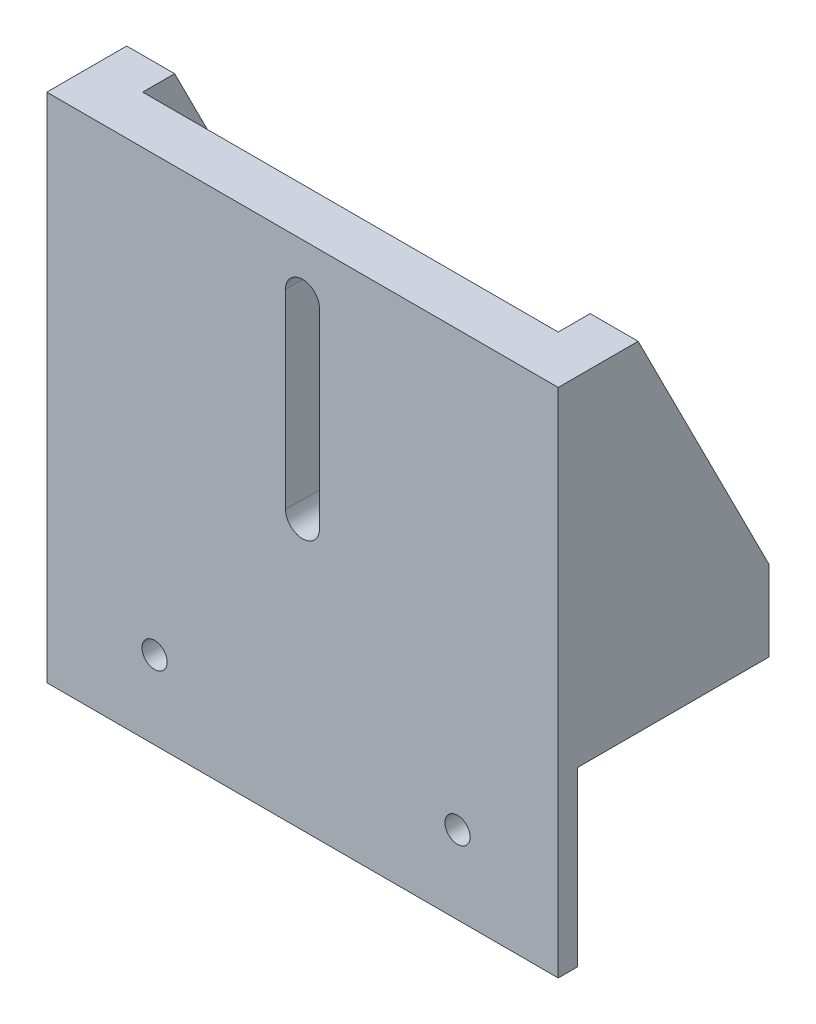
ISO-10303-21;
HEADER;
FILE_DESCRIPTION(('STEP AP214'),'2;1');
FILE_NAME('part.step','',(''),(''),'','','');
FILE_SCHEMA(('AUTOMOTIVE_DESIGN { 1 0 10303 214 1 1 1 1 }'));
ENDSEC;
DATA;
#1=APPLICATION_CONTEXT('core data for automotive mechanical design processes');
#2=APPLICATION_PROTOCOL_DEFINITION('international standard','automotive_design',2000,#1);
#3=PRODUCT_CONTEXT('',#1,'mechanical');
#4=PRODUCT('Part','Part','',(#3));
#5=PRODUCT_RELATED_PRODUCT_CATEGORY('part','',(#4));
#6=PRODUCT_DEFINITION_FORMATION('','',#4);
#7=PRODUCT_DEFINITION_CONTEXT('part definition',#1,'design');
#8=PRODUCT_DEFINITION('design','',#6,#7);
#9=PRODUCT_DEFINITION_SHAPE('','',#8);
#10=(LENGTH_UNIT() NAMED_UNIT(*) SI_UNIT(.MILLI.,.METRE.));
#11=(NAMED_UNIT(*) PLANE_ANGLE_UNIT() SI_UNIT($,.RADIAN.));
#12=(NAMED_UNIT(*) SI_UNIT($,.STERADIAN.) SOLID_ANGLE_UNIT());
#13=UNCERTAINTY_MEASURE_WITH_UNIT(LENGTH_MEASURE(1.E-05),#10,'distance_accuracy_value','');
#14=(GEOMETRIC_REPRESENTATION_CONTEXT(3) GLOBAL_UNCERTAINTY_ASSIGNED_CONTEXT((#13)) GLOBAL_UNIT_ASSIGNED_CONTEXT((#10,
#11,#12)) REPRESENTATION_CONTEXT('',''));
#15=CARTESIAN_POINT('',(0.,0.,0.));
#16=DIRECTION('',(0.,0.,1.));
#17=DIRECTION('',(1.,0.,0.));
#18=AXIS2_PLACEMENT_3D('',#15,#16,#17);
#19=CARTESIAN_POINT('',(0.,0.,-5.715));
#20=DIRECTION('',(0.,0.,-1.));
#21=DIRECTION('',(-1.,0.,0.));
#22=AXIS2_PLACEMENT_3D('',#19,#20,#21);
#23=PLANE('',#22);
#24=DIRECTION('',(0.,1.,0.));
#25=VECTOR('',#24,1.);
#26=CARTESIAN_POINT('',(-54.1782,91.6432,-5.715));
#27=LINE('',#26,#25);
#28=CARTESIAN_POINT('',(-54.1782,91.6432,-5.715));
#29=VERTEX_POINT('',#28);
#30=CARTESIAN_POINT('',(-54.1782,129.5146,-5.715));
#31=VERTEX_POINT('',#30);
#32=EDGE_CURVE('E304',#29,#31,#27,.T.);
#33=ORIENTED_EDGE('',*,*,#32,.F.);
#34=CARTESIAN_POINT('',(-50.8,91.6432,-5.715));
#35=DIRECTION('',(0.,0.,-1.));
#36=DIRECTION('',(-1.,0.,0.));
#37=AXIS2_PLACEMENT_3D('',#34,#35,#36);
#38=CIRCLE('',#37,3.3782);
#39=CARTESIAN_POINT('',(-47.4218,91.6432,-5.715));
#40=VERTEX_POINT('',#39);
#41=EDGE_CURVE('E314',#40,#29,#38,.T.);
#42=ORIENTED_EDGE('',*,*,#41,.F.);
#43=DIRECTION('',(0.,1.,0.));
#44=VECTOR('',#43,1.);
#45=CARTESIAN_POINT('',(-47.4218,91.6432,-5.715));
#46=LINE('',#45,#44);
#47=CARTESIAN_POINT('',(-47.4218,129.5146,-5.715));
#48=VERTEX_POINT('',#47);
#49=EDGE_CURVE('E312',#40,#48,#46,.T.);
#50=ORIENTED_EDGE('',*,*,#49,.T.);
#51=CARTESIAN_POINT('',(-50.8,129.5146,-5.715));
#52=DIRECTION('',(0.,0.,-1.));
#53=DIRECTION('',(-1.,0.,0.));
#54=AXIS2_PLACEMENT_3D('',#51,#52,#53);
#55=CIRCLE('',#54,3.3782);
#56=EDGE_CURVE('E253',#31,#48,#55,.T.);
#57=ORIENTED_EDGE('',*,*,#56,.F.);
#58=EDGE_LOOP('',(#33,#42,#50,#57));
#59=FACE_BOUND('',#58,.T.);
#60=DIRECTION('',(1.,0.,0.));
#61=VECTOR('',#60,1.);
#62=CARTESIAN_POINT('',(0.,81.915,-5.715));
#63=LINE('',#62,#61);
#64=CARTESIAN_POINT('',(-92.0750000000002,81.915,-5.715));
#65=VERTEX_POINT('',#64);
#66=CARTESIAN_POINT('',(-9.525,81.915,-5.715));
#67=VERTEX_POINT('',#66);
#68=EDGE_CURVE('E239',#65,#67,#63,.T.);
#69=ORIENTED_EDGE('',*,*,#68,.F.);
#70=DIRECTION('',(0.,1.,0.));
#71=VECTOR('',#70,1.);
#72=CARTESIAN_POINT('',(-92.0750000000002,81.915,-5.715));
#73=LINE('',#72,#71);
#74=CARTESIAN_POINT('',(-92.0750000000002,139.7,-5.715));
#75=VERTEX_POINT('',#74);
#76=EDGE_CURVE('E224',#65,#75,#73,.T.);
#77=ORIENTED_EDGE('',*,*,#76,.T.);
#78=DIRECTION('',(1.,0.,0.));
#79=VECTOR('',#78,1.);
#80=CARTESIAN_POINT('',(0.,139.7,-5.715));
#81=LINE('',#80,#79);
#82=CARTESIAN_POINT('',(-9.525,139.7,-5.715));
#83=VERTEX_POINT('',#82);
#84=EDGE_CURVE('E262',#75,#83,#81,.T.);
#85=ORIENTED_EDGE('',*,*,#84,.T.);
#86=DIRECTION('',(0.,-1.,0.));
#87=VECTOR('',#86,1.);
#88=CARTESIAN_POINT('',(-9.525,139.7,-5.715));
#89=LINE('',#88,#87);
#90=EDGE_CURVE('E245',#83,#67,#89,.T.);
#91=ORIENTED_EDGE('',*,*,#90,.T.);
#92=EDGE_LOOP('',(#69,#77,#85,#91));
#93=FACE_BOUND('',#92,.T.);
#94=ADVANCED_FACE('F109',(#59,#93),#23,.T.);
#95=CARTESIAN_POINT('',(0.,81.915,-38.1000000000002));
#96=DIRECTION('',(0.,-1.,0.));
#97=DIRECTION('',(0.,0.,-1.));
#98=AXIS2_PLACEMENT_3D('',#95,#96,#97);
#99=PLANE('',#98);
#100=CARTESIAN_POINT('',(-31.75,81.915,-19.05));
#101=DIRECTION('',(0.,1.,0.));
#102=DIRECTION('',(0.,0.,1.));
#103=AXIS2_PLACEMENT_3D('',#100,#101,#102);
#104=CIRCLE('',#103,6.7437);
#105=CARTESIAN_POINT('',(-31.75,81.915,-12.3063));
#106=VERTEX_POINT('',#105);
#107=EDGE_CURVE('E399',#106,#106,#104,.T.);
#108=ORIENTED_EDGE('',*,*,#107,.F.);
#109=EDGE_LOOP('',(#108));
#110=FACE_BOUND('',#109,.T.);
#111=CARTESIAN_POINT('',(-69.85,81.915,-19.05));
#112=DIRECTION('',(0.,1.,0.));
#113=DIRECTION('',(0.,0.,1.));
#114=AXIS2_PLACEMENT_3D('',#111,#112,#113);
#115=CIRCLE('',#114,6.7437);
#116=CARTESIAN_POINT('',(-69.85,81.915,-12.3063));
#117=VERTEX_POINT('',#116);
#118=EDGE_CURVE('E393',#117,#117,#115,.T.);
#119=ORIENTED_EDGE('',*,*,#118,.F.);
#120=EDGE_LOOP('',(#119));
#121=FACE_BOUND('',#120,.T.);
#122=DIRECTION('',(0.,0.,1.));
#123=VECTOR('',#122,1.);
#124=CARTESIAN_POINT('',(-92.0750000000002,81.915,-38.1));
#125=LINE('',#124,#123);
#126=CARTESIAN_POINT('',(-92.0750000000002,81.915,-38.1000000000002));
#127=VERTEX_POINT('',#126);
#128=EDGE_CURVE('E227',#127,#65,#125,.T.);
#129=ORIENTED_EDGE('',*,*,#128,.T.);
#130=ORIENTED_EDGE('',*,*,#68,.T.);
#131=DIRECTION('',(0.,0.,-1.));
#132=VECTOR('',#131,1.);
#133=CARTESIAN_POINT('',(-9.525,81.915,-5.715));
#134=LINE('',#133,#132);
#135=CARTESIAN_POINT('',(-9.525,81.915,-38.1));
#136=VERTEX_POINT('',#135);
#137=EDGE_CURVE('E335',#67,#136,#134,.T.);
#138=ORIENTED_EDGE('',*,*,#137,.T.);
#139=DIRECTION('',(1.,0.,0.));
#140=VECTOR('',#139,1.);
#141=CARTESIAN_POINT('',(0.,81.915,-38.1000000000002));
#142=LINE('',#141,#140);
#143=EDGE_CURVE('E241',#127,#136,#142,.T.);
#144=ORIENTED_EDGE('',*,*,#143,.F.);
#145=EDGE_LOOP('',(#129,#130,#138,#144));
#146=FACE_BOUND('',#145,.T.);
#147=ADVANCED_FACE('F237',(#110,#121,#146),#99,.F.);
#148=CARTESIAN_POINT('',(0.,0.,3.81));
#149=DIRECTION('',(0.,0.,1.));
#150=DIRECTION('',(1.,0.,0.));
#151=AXIS2_PLACEMENT_3D('',#148,#149,#150);
#152=PLANE('',#151);
#153=DIRECTION('',(0.,1.,0.));
#154=VECTOR('',#153,1.);
#155=CARTESIAN_POINT('',(0.,38.1,3.81));
#156=LINE('',#155,#154);
#157=CARTESIAN_POINT('',(0.,38.1,3.81));
#158=VERTEX_POINT('',#157);
#159=CARTESIAN_POINT('',(0.,139.7,3.81));
#160=VERTEX_POINT('',#159);
#161=EDGE_CURVE('E476',#158,#160,#156,.T.);
#162=ORIENTED_EDGE('',*,*,#161,.T.);
#163=DIRECTION('',(-1.,0.,0.));
#164=VECTOR('',#163,1.);
#165=CARTESIAN_POINT('',(0.,139.7,3.81));
#166=LINE('',#165,#164);
#167=CARTESIAN_POINT('',(-101.6,139.7,3.81));
#168=VERTEX_POINT('',#167);
#169=EDGE_CURVE('E460',#160,#168,#166,.T.);
#170=ORIENTED_EDGE('',*,*,#169,.T.);
#171=DIRECTION('',(0.,-1.,0.));
#172=VECTOR('',#171,1.);
#173=CARTESIAN_POINT('',(-101.6,38.1,3.81));
#174=LINE('',#173,#172);
#175=CARTESIAN_POINT('',(-101.6,38.1,3.81));
#176=VERTEX_POINT('',#175);
#177=EDGE_CURVE('E484',#168,#176,#174,.T.);
#178=ORIENTED_EDGE('',*,*,#177,.T.);
#179=DIRECTION('',(1.,0.,0.));
#180=VECTOR('',#179,1.);
#181=CARTESIAN_POINT('',(0.,38.1,3.81));
#182=LINE('',#181,#180);
#183=EDGE_CURVE('E470',#176,#158,#182,.T.);
#184=ORIENTED_EDGE('',*,*,#183,.T.);
#185=EDGE_LOOP('',(#162,#170,#178,#184));
#186=FACE_BOUND('',#185,.T.);
#187=CARTESIAN_POINT('',(-80.1872457791835,53.5862401288938,3.81));
#188=DIRECTION('',(0.,0.,1.));
#189=DIRECTION('',(1.,0.,0.));
#190=AXIS2_PLACEMENT_3D('',#187,#188,#189);
#191=CIRCLE('',#190,2.5);
#192=CARTESIAN_POINT('',(-77.6872457791835,53.5862401288938,3.81));
#193=VERTEX_POINT('',#192);
#194=EDGE_CURVE('E467',#193,#193,#191,.T.);
#195=ORIENTED_EDGE('',*,*,#194,.F.);
#196=EDGE_LOOP('',(#195));
#197=FACE_BOUND('',#196,.T.);
#198=CARTESIAN_POINT('',(-20.0048383256093,53.5862401288938,3.81));
#199=DIRECTION('',(0.,0.,1.));
#200=DIRECTION('',(1.,0.,0.));
#201=AXIS2_PLACEMENT_3D('',#198,#199,#200);
#202=CIRCLE('',#201,2.5);
#203=CARTESIAN_POINT('',(-17.5048383256094,53.5862401288938,3.81));
#204=VERTEX_POINT('',#203);
#205=EDGE_CURVE('E492',#204,#204,#202,.T.);
#206=ORIENTED_EDGE('',*,*,#205,.F.);
#207=EDGE_LOOP('',(#206));
#208=FACE_BOUND('',#207,.T.);
#209=CARTESIAN_POINT('',(-50.8,129.5146,3.81));
#210=DIRECTION('',(0.,0.,1.));
#211=DIRECTION('',(1.,0.,0.));
#212=AXIS2_PLACEMENT_3D('',#209,#210,#211);
#213=CIRCLE('',#212,3.3782);
#214=CARTESIAN_POINT('',(-47.4218,129.5146,3.81));
#215=VERTEX_POINT('',#214);
#216=CARTESIAN_POINT('',(-54.1782,129.5146,3.81));
#217=VERTEX_POINT('',#216);
#218=EDGE_CURVE('E118',#215,#217,#213,.T.);
#219=ORIENTED_EDGE('',*,*,#218,.F.);
#220=DIRECTION('',(0.,-1.,0.));
#221=VECTOR('',#220,1.);
#222=CARTESIAN_POINT('',(-47.4218,0.,3.81));
#223=LINE('',#222,#221);
#224=CARTESIAN_POINT('',(-47.4218,91.6432,3.81));
#225=VERTEX_POINT('',#224);
#226=EDGE_CURVE('E13',#215,#225,#223,.T.);
#227=ORIENTED_EDGE('',*,*,#226,.T.);
#228=CARTESIAN_POINT('',(-50.8,91.6432,3.81));
#229=DIRECTION('',(0.,0.,1.));
#230=DIRECTION('',(1.,0.,0.));
#231=AXIS2_PLACEMENT_3D('',#228,#229,#230);
#232=CIRCLE('',#231,3.3782);
#233=CARTESIAN_POINT('',(-54.1782,91.6432,3.81));
#234=VERTEX_POINT('',#233);
#235=EDGE_CURVE('E288',#234,#225,#232,.T.);
#236=ORIENTED_EDGE('',*,*,#235,.F.);
#237=DIRECTION('',(0.,-1.,0.));
#238=VECTOR('',#237,1.);
#239=CARTESIAN_POINT('',(-54.1782,0.,3.81));
#240=LINE('',#239,#238);
#241=EDGE_CURVE('E286',#217,#234,#240,.T.);
#242=ORIENTED_EDGE('',*,*,#241,.F.);
#243=EDGE_LOOP('',(#219,#227,#236,#242));
#244=FACE_BOUND('',#243,.T.);
#245=ADVANCED_FACE('F306',(#186,#197,#208,#244),#152,.T.);
#246=CARTESIAN_POINT('',(0.,0.,0.));
#247=DIRECTION('',(0.,0.,1.));
#248=DIRECTION('',(1.,0.,0.));
#249=AXIS2_PLACEMENT_3D('',#246,#247,#248);
#250=PLANE('',#249);
#251=CARTESIAN_POINT('',(-80.1872457791835,53.5862401288938,0.));
#252=DIRECTION('',(0.,0.,-1.));
#253=DIRECTION('',(-1.,0.,0.));
#254=AXIS2_PLACEMENT_3D('',#251,#252,#253);
#255=CIRCLE('',#254,2.5);
#256=CARTESIAN_POINT('',(-82.6872457791835,53.5862401288938,0.));
#257=VERTEX_POINT('',#256);
#258=EDGE_CURVE('E490',#257,#257,#255,.T.);
#259=ORIENTED_EDGE('',*,*,#258,.F.);
#260=EDGE_LOOP('',(#259));
#261=FACE_BOUND('',#260,.T.);
#262=CARTESIAN_POINT('',(-20.0048383256093,53.5862401288938,0.));
#263=DIRECTION('',(0.,0.,-1.));
#264=DIRECTION('',(-1.,0.,0.));
#265=AXIS2_PLACEMENT_3D('',#262,#263,#264);
#266=CIRCLE('',#265,2.5);
#267=CARTESIAN_POINT('',(-22.5048383256093,53.5862401288938,0.));
#268=VERTEX_POINT('',#267);
#269=EDGE_CURVE('E268',#268,#268,#266,.T.);
#270=ORIENTED_EDGE('',*,*,#269,.F.);
#271=EDGE_LOOP('',(#270));
#272=FACE_BOUND('',#271,.T.);
#273=DIRECTION('',(-1.,0.,0.));
#274=VECTOR('',#273,1.);
#275=CARTESIAN_POINT('',(0.,72.39,0.));
#276=LINE('',#275,#274);
#277=CARTESIAN_POINT('',(0.,72.39,0.));
#278=VERTEX_POINT('',#277);
#279=CARTESIAN_POINT('',(-101.6,72.39,0.));
#280=VERTEX_POINT('',#279);
#281=EDGE_CURVE('E265',#278,#280,#276,.T.);
#282=ORIENTED_EDGE('',*,*,#281,.F.);
#283=DIRECTION('',(0.,1.,0.));
#284=VECTOR('',#283,1.);
#285=CARTESIAN_POINT('',(0.,38.1,0.));
#286=LINE('',#285,#284);
#287=CARTESIAN_POINT('',(0.,38.1,0.));
#288=VERTEX_POINT('',#287);
#289=EDGE_CURVE('E368',#288,#278,#286,.T.);
#290=ORIENTED_EDGE('',*,*,#289,.F.);
#291=DIRECTION('',(1.,0.,0.));
#292=VECTOR('',#291,1.);
#293=CARTESIAN_POINT('',(0.,38.1,0.));
#294=LINE('',#293,#292);
#295=CARTESIAN_POINT('',(-101.6,38.1,0.));
#296=VERTEX_POINT('',#295);
#297=EDGE_CURVE('E474',#296,#288,#294,.T.);
#298=ORIENTED_EDGE('',*,*,#297,.F.);
#299=DIRECTION('',(0.,-1.,0.));
#300=VECTOR('',#299,1.);
#301=CARTESIAN_POINT('',(-101.6,38.1,0.));
#302=LINE('',#301,#300);
#303=EDGE_CURVE('E274',#280,#296,#302,.T.);
#304=ORIENTED_EDGE('',*,*,#303,.F.);
#305=EDGE_LOOP('',(#282,#290,#298,#304));
#306=FACE_BOUND('',#305,.T.);
#307=ADVANCED_FACE('F446',(#261,#272,#306),#250,.F.);
#308=CARTESIAN_POINT('',(0.,38.1,3.81));
#309=DIRECTION('',(-1.,0.,0.));
#310=DIRECTION('',(0.,-1.,0.));
#311=AXIS2_PLACEMENT_3D('',#308,#309,#310);
#312=PLANE('',#311);
#313=ORIENTED_EDGE('',*,*,#289,.T.);
#314=DIRECTION('',(0.,0.,1.));
#315=VECTOR('',#314,1.);
#316=CARTESIAN_POINT('',(0.,72.39,-5.715));
#317=LINE('',#316,#315);
#318=CARTESIAN_POINT('',(0.,72.39,-38.1000000000002));
#319=VERTEX_POINT('',#318);
#320=EDGE_CURVE('E279',#319,#278,#317,.T.);
#321=ORIENTED_EDGE('',*,*,#320,.F.);
#322=DIRECTION('',(0.,-1.,0.));
#323=VECTOR('',#322,1.);
#324=CARTESIAN_POINT('',(0.,72.39,-38.1000000000002));
#325=LINE('',#324,#323);
#326=CARTESIAN_POINT('',(0.,88.265,-38.1));
#327=VERTEX_POINT('',#326);
#328=EDGE_CURVE('E246',#327,#319,#325,.T.);
#329=ORIENTED_EDGE('',*,*,#328,.F.);
#330=DIRECTION('',(0.,0.892213342960613,0.451614161251669));
#331=VECTOR('',#330,1.);
#332=CARTESIAN_POINT('',(0.,88.265,-38.1));
#333=LINE('',#332,#331);
#334=CARTESIAN_POINT('',(0.,139.7,-12.065));
#335=VERTEX_POINT('',#334);
#336=EDGE_CURVE('E340',#327,#335,#333,.T.);
#337=ORIENTED_EDGE('',*,*,#336,.T.);
#338=DIRECTION('',(0.,0.,-1.));
#339=VECTOR('',#338,1.);
#340=CARTESIAN_POINT('',(0.,139.7,3.81));
#341=LINE('',#340,#339);
#342=EDGE_CURVE('E289',#160,#335,#341,.T.);
#343=ORIENTED_EDGE('',*,*,#342,.F.);
#344=ORIENTED_EDGE('',*,*,#161,.F.);
#345=DIRECTION('',(0.,0.,-1.));
#346=VECTOR('',#345,1.);
#347=CARTESIAN_POINT('',(0.,38.1,3.81));
#348=LINE('',#347,#346);
#349=EDGE_CURVE('E477',#158,#288,#348,.T.);
#350=ORIENTED_EDGE('',*,*,#349,.T.);
#351=EDGE_LOOP('',(#313,#321,#329,#337,#343,#344,#350));
#352=FACE_BOUND('',#351,.T.);
#353=ADVANCED_FACE('F111',(#352),#312,.F.);
#354=CARTESIAN_POINT('',(0.,139.7,3.81));
#355=DIRECTION('',(0.,-1.,0.));
#356=DIRECTION('',(0.,0.,-1.));
#357=AXIS2_PLACEMENT_3D('',#354,#355,#356);
#358=PLANE('',#357);
#359=ORIENTED_EDGE('',*,*,#342,.T.);
#360=DIRECTION('',(1.,0.,0.));
#361=VECTOR('',#360,1.);
#362=CARTESIAN_POINT('',(-9.525,139.7,-12.065));
#363=LINE('',#362,#361);
#364=CARTESIAN_POINT('',(-9.525,139.7,-12.065));
#365=VERTEX_POINT('',#364);
#366=EDGE_CURVE('E355',#365,#335,#363,.T.);
#367=ORIENTED_EDGE('',*,*,#366,.F.);
#368=DIRECTION('',(0.,0.,1.));
#369=VECTOR('',#368,1.);
#370=CARTESIAN_POINT('',(-9.525,139.7,-12.065));
#371=LINE('',#370,#369);
#372=EDGE_CURVE('E350',#365,#83,#371,.T.);
#373=ORIENTED_EDGE('',*,*,#372,.T.);
#374=ORIENTED_EDGE('',*,*,#84,.F.);
#375=DIRECTION('',(0.,0.,-1.));
#376=VECTOR('',#375,1.);
#377=CARTESIAN_POINT('',(-92.0750000000002,139.7,-5.715));
#378=LINE('',#377,#376);
#379=CARTESIAN_POINT('',(-92.0750000000002,139.7,-12.065));
#380=VERTEX_POINT('',#379);
#381=EDGE_CURVE('E231',#75,#380,#378,.T.);
#382=ORIENTED_EDGE('',*,*,#381,.T.);
#383=DIRECTION('',(-1.,0.,0.));
#384=VECTOR('',#383,1.);
#385=CARTESIAN_POINT('',(-92.0750000000002,139.7,-12.065));
#386=LINE('',#385,#384);
#387=CARTESIAN_POINT('',(-101.6,139.7,-12.065));
#388=VERTEX_POINT('',#387);
#389=EDGE_CURVE('E346',#380,#388,#386,.T.);
#390=ORIENTED_EDGE('',*,*,#389,.T.);
#391=DIRECTION('',(0.,0.,-1.));
#392=VECTOR('',#391,1.);
#393=CARTESIAN_POINT('',(-101.6,139.7,3.81));
#394=LINE('',#393,#392);
#395=EDGE_CURVE('E378',#168,#388,#394,.T.);
#396=ORIENTED_EDGE('',*,*,#395,.F.);
#397=ORIENTED_EDGE('',*,*,#169,.F.);
#398=EDGE_LOOP('',(#359,#367,#373,#374,#382,#390,#396,#397));
#399=FACE_BOUND('',#398,.T.);
#400=ADVANCED_FACE('F455',(#399),#358,.F.);
#401=CARTESIAN_POINT('',(-101.6,38.1,3.81));
#402=DIRECTION('',(1.,0.,0.));
#403=DIRECTION('',(0.,1.,0.));
#404=AXIS2_PLACEMENT_3D('',#401,#402,#403);
#405=PLANE('',#404);
#406=ORIENTED_EDGE('',*,*,#395,.T.);
#407=DIRECTION('',(0.,-0.892213342960613,-0.451614161251669));
#408=VECTOR('',#407,1.);
#409=CARTESIAN_POINT('',(-101.6,139.7,-12.065));
#410=LINE('',#409,#408);
#411=CARTESIAN_POINT('',(-101.6,88.265,-38.1));
#412=VERTEX_POINT('',#411);
#413=EDGE_CURVE('E375',#388,#412,#410,.T.);
#414=ORIENTED_EDGE('',*,*,#413,.T.);
#415=DIRECTION('',(0.,1.,0.));
#416=VECTOR('',#415,1.);
#417=CARTESIAN_POINT('',(-101.6,72.39,-38.1000000000002));
#418=LINE('',#417,#416);
#419=CARTESIAN_POINT('',(-101.6,72.39,-38.1000000000002));
#420=VERTEX_POINT('',#419);
#421=EDGE_CURVE('E324',#420,#412,#418,.T.);
#422=ORIENTED_EDGE('',*,*,#421,.F.);
#423=DIRECTION('',(0.,0.,1.));
#424=VECTOR('',#423,1.);
#425=CARTESIAN_POINT('',(-101.6,72.39,-5.715));
#426=LINE('',#425,#424);
#427=EDGE_CURVE('E264',#420,#280,#426,.T.);
#428=ORIENTED_EDGE('',*,*,#427,.T.);
#429=ORIENTED_EDGE('',*,*,#303,.T.);
#430=DIRECTION('',(0.,0.,-1.));
#431=VECTOR('',#430,1.);
#432=CARTESIAN_POINT('',(-101.6,38.1,3.81));
#433=LINE('',#432,#431);
#434=EDGE_CURVE('E463',#176,#296,#433,.T.);
#435=ORIENTED_EDGE('',*,*,#434,.F.);
#436=ORIENTED_EDGE('',*,*,#177,.F.);
#437=EDGE_LOOP('',(#406,#414,#422,#428,#429,#435,#436));
#438=FACE_BOUND('',#437,.T.);
#439=ADVANCED_FACE('F373',(#438),#405,.F.);
#440=CARTESIAN_POINT('',(0.,38.1,3.81));
#441=DIRECTION('',(0.,1.,0.));
#442=DIRECTION('',(0.,0.,1.));
#443=AXIS2_PLACEMENT_3D('',#440,#441,#442);
#444=PLANE('',#443);
#445=ORIENTED_EDGE('',*,*,#297,.T.);
#446=ORIENTED_EDGE('',*,*,#349,.F.);
#447=ORIENTED_EDGE('',*,*,#183,.F.);
#448=ORIENTED_EDGE('',*,*,#434,.T.);
#449=EDGE_LOOP('',(#445,#446,#447,#448));
#450=FACE_BOUND('',#449,.T.);
#451=ADVANCED_FACE('F442',(#450),#444,.F.);
#452=CARTESIAN_POINT('',(-80.1872457791835,53.5862401288938,0.));
#453=DIRECTION('',(0.,0.,-1.));
#454=DIRECTION('',(-1.,0.,0.));
#455=AXIS2_PLACEMENT_3D('',#452,#453,#454);
#456=CYLINDRICAL_SURFACE('',#455,2.5);
#457=ORIENTED_EDGE('',*,*,#194,.T.);
#458=EDGE_LOOP('',(#457));
#459=FACE_BOUND('',#458,.T.);
#460=ORIENTED_EDGE('',*,*,#258,.T.);
#461=EDGE_LOOP('',(#460));
#462=FACE_BOUND('',#461,.T.);
#463=ADVANCED_FACE('F438',(#459,#462),#456,.F.);
#464=CARTESIAN_POINT('',(-20.0048383256093,53.5862401288938,0.));
#465=DIRECTION('',(0.,0.,-1.));
#466=DIRECTION('',(-1.,0.,0.));
#467=AXIS2_PLACEMENT_3D('',#464,#465,#466);
#468=CYLINDRICAL_SURFACE('',#467,2.5);
#469=ORIENTED_EDGE('',*,*,#205,.T.);
#470=EDGE_LOOP('',(#469));
#471=FACE_BOUND('',#470,.T.);
#472=ORIENTED_EDGE('',*,*,#269,.T.);
#473=EDGE_LOOP('',(#472));
#474=FACE_BOUND('',#473,.T.);
#475=ADVANCED_FACE('F434',(#471,#474),#468,.F.);
#476=CARTESIAN_POINT('',(0.,72.39,-5.715));
#477=DIRECTION('',(0.,1.,0.));
#478=DIRECTION('',(0.,0.,1.));
#479=AXIS2_PLACEMENT_3D('',#476,#477,#478);
#480=PLANE('',#479);
#481=CARTESIAN_POINT('',(-31.75,72.39,-19.05));
#482=DIRECTION('',(0.,1.,0.));
#483=DIRECTION('',(0.,0.,1.));
#484=AXIS2_PLACEMENT_3D('',#481,#482,#483);
#485=CIRCLE('',#484,3.37819999999999);
#486=CARTESIAN_POINT('',(-31.75,72.39,-15.6718));
#487=VERTEX_POINT('',#486);
#488=EDGE_CURVE('E113',#487,#487,#485,.T.);
#489=ORIENTED_EDGE('',*,*,#488,.T.);
#490=EDGE_LOOP('',(#489));
#491=FACE_BOUND('',#490,.T.);
#492=CARTESIAN_POINT('',(-69.85,72.39,-19.05));
#493=DIRECTION('',(0.,1.,0.));
#494=DIRECTION('',(0.,0.,1.));
#495=AXIS2_PLACEMENT_3D('',#492,#493,#494);
#496=CIRCLE('',#495,3.37819999999998);
#497=CARTESIAN_POINT('',(-69.85,72.39,-15.6718));
#498=VERTEX_POINT('',#497);
#499=EDGE_CURVE('E257',#498,#498,#496,.T.);
#500=ORIENTED_EDGE('',*,*,#499,.T.);
#501=EDGE_LOOP('',(#500));
#502=FACE_BOUND('',#501,.T.);
#503=ORIENTED_EDGE('',*,*,#281,.T.);
#504=ORIENTED_EDGE('',*,*,#427,.F.);
#505=DIRECTION('',(-1.,0.,0.));
#506=VECTOR('',#505,1.);
#507=CARTESIAN_POINT('',(0.,72.39,-38.1000000000002));
#508=LINE('',#507,#506);
#509=EDGE_CURVE('E250',#319,#420,#508,.T.);
#510=ORIENTED_EDGE('',*,*,#509,.F.);
#511=ORIENTED_EDGE('',*,*,#320,.T.);
#512=EDGE_LOOP('',(#503,#504,#510,#511));
#513=FACE_BOUND('',#512,.T.);
#514=ADVANCED_FACE('F370',(#491,#502,#513),#480,.F.);
#515=CARTESIAN_POINT('',(0.,0.,-38.1000000000002));
#516=DIRECTION('',(0.,0.,1.));
#517=DIRECTION('',(1.,0.,0.));
#518=AXIS2_PLACEMENT_3D('',#515,#516,#517);
#519=PLANE('',#518);
#520=ORIENTED_EDGE('',*,*,#328,.T.);
#521=ORIENTED_EDGE('',*,*,#509,.T.);
#522=ORIENTED_EDGE('',*,*,#421,.T.);
#523=DIRECTION('',(-1.,0.,0.));
#524=VECTOR('',#523,1.);
#525=CARTESIAN_POINT('',(-92.0750000000002,88.265,-38.1));
#526=LINE('',#525,#524);
#527=CARTESIAN_POINT('',(-92.0750000000002,88.265,-38.1));
#528=VERTEX_POINT('',#527);
#529=EDGE_CURVE('E343',#528,#412,#526,.T.);
#530=ORIENTED_EDGE('',*,*,#529,.F.);
#531=DIRECTION('',(0.,-1.,0.));
#532=VECTOR('',#531,1.);
#533=CARTESIAN_POINT('',(-92.0750000000002,88.265,-38.1));
#534=LINE('',#533,#532);
#535=EDGE_CURVE('E126',#528,#127,#534,.T.);
#536=ORIENTED_EDGE('',*,*,#535,.T.);
#537=ORIENTED_EDGE('',*,*,#143,.T.);
#538=DIRECTION('',(0.,1.,0.));
#539=VECTOR('',#538,1.);
#540=CARTESIAN_POINT('',(-9.525,81.915,-38.1));
#541=LINE('',#540,#539);
#542=CARTESIAN_POINT('',(-9.525,88.265,-38.1));
#543=VERTEX_POINT('',#542);
#544=EDGE_CURVE('E331',#136,#543,#541,.T.);
#545=ORIENTED_EDGE('',*,*,#544,.T.);
#546=DIRECTION('',(1.,0.,0.));
#547=VECTOR('',#546,1.);
#548=CARTESIAN_POINT('',(-9.525,88.265,-38.1));
#549=LINE('',#548,#547);
#550=EDGE_CURVE('E353',#543,#327,#549,.T.);
#551=ORIENTED_EDGE('',*,*,#550,.T.);
#552=EDGE_LOOP('',(#520,#521,#522,#530,#536,#537,#545,#551));
#553=FACE_BOUND('',#552,.T.);
#554=ADVANCED_FACE('F329',(#553),#519,.F.);
#555=CARTESIAN_POINT('',(-50.8,129.5146,-5.715));
#556=DIRECTION('',(0.,0.,-1.));
#557=DIRECTION('',(-1.,0.,0.));
#558=AXIS2_PLACEMENT_3D('',#555,#556,#557);
#559=CYLINDRICAL_SURFACE('',#558,3.3782);
#560=ORIENTED_EDGE('',*,*,#218,.T.);
#561=DIRECTION('',(0.,0.,-1.));
#562=VECTOR('',#561,1.);
#563=CARTESIAN_POINT('',(-54.1782,129.5146,-5.715));
#564=LINE('',#563,#562);
#565=EDGE_CURVE('E247',#31,#217,#564,.F.);
#566=ORIENTED_EDGE('',*,*,#565,.F.);
#567=ORIENTED_EDGE('',*,*,#56,.T.);
#568=DIRECTION('',(0.,0.,1.));
#569=VECTOR('',#568,1.);
#570=CARTESIAN_POINT('',(-47.4218,129.5146,3.811));
#571=LINE('',#570,#569);
#572=EDGE_CURVE('E296',#48,#215,#571,.T.);
#573=ORIENTED_EDGE('',*,*,#572,.T.);
#574=EDGE_LOOP('',(#560,#566,#567,#573));
#575=FACE_BOUND('',#574,.T.);
#576=ADVANCED_FACE('F293',(#575),#559,.F.);
#577=CARTESIAN_POINT('',(-50.8,91.6432,-5.715));
#578=DIRECTION('',(0.,0.,-1.));
#579=DIRECTION('',(-1.,0.,0.));
#580=AXIS2_PLACEMENT_3D('',#577,#578,#579);
#581=CYLINDRICAL_SURFACE('',#580,3.3782);
#582=ORIENTED_EDGE('',*,*,#235,.T.);
#583=DIRECTION('',(0.,0.,1.));
#584=VECTOR('',#583,1.);
#585=CARTESIAN_POINT('',(-47.4218,91.6432,3.811));
#586=LINE('',#585,#584);
#587=EDGE_CURVE('E134',#40,#225,#586,.T.);
#588=ORIENTED_EDGE('',*,*,#587,.F.);
#589=ORIENTED_EDGE('',*,*,#41,.T.);
#590=DIRECTION('',(0.,0.,-1.));
#591=VECTOR('',#590,1.);
#592=CARTESIAN_POINT('',(-54.1782,91.6432,-5.715));
#593=LINE('',#592,#591);
#594=EDGE_CURVE('E308',#234,#29,#593,.T.);
#595=ORIENTED_EDGE('',*,*,#594,.F.);
#596=EDGE_LOOP('',(#582,#588,#589,#595));
#597=FACE_BOUND('',#596,.T.);
#598=ADVANCED_FACE('F307',(#597),#581,.F.);
#599=CARTESIAN_POINT('',(-47.4218,91.6432,3.811));
#600=DIRECTION('',(-1.,0.,0.));
#601=DIRECTION('',(0.,0.,1.));
#602=AXIS2_PLACEMENT_3D('',#599,#600,#601);
#603=PLANE('',#602);
#604=ORIENTED_EDGE('',*,*,#572,.F.);
#605=ORIENTED_EDGE('',*,*,#49,.F.);
#606=ORIENTED_EDGE('',*,*,#587,.T.);
#607=ORIENTED_EDGE('',*,*,#226,.F.);
#608=EDGE_LOOP('',(#604,#605,#606,#607));
#609=FACE_BOUND('',#608,.T.);
#610=ADVANCED_FACE('F310',(#609),#603,.T.);
#611=CARTESIAN_POINT('',(-54.1782,91.6432,-5.715));
#612=DIRECTION('',(-1.,0.,0.));
#613=DIRECTION('',(0.,0.,1.));
#614=AXIS2_PLACEMENT_3D('',#611,#612,#613);
#615=PLANE('',#614);
#616=ORIENTED_EDGE('',*,*,#241,.T.);
#617=ORIENTED_EDGE('',*,*,#594,.T.);
#618=ORIENTED_EDGE('',*,*,#32,.T.);
#619=ORIENTED_EDGE('',*,*,#565,.T.);
#620=EDGE_LOOP('',(#616,#617,#618,#619));
#621=FACE_BOUND('',#620,.T.);
#622=ADVANCED_FACE('F301',(#621),#615,.F.);
#623=CARTESIAN_POINT('',(-9.525,88.265,-38.1));
#624=DIRECTION('',(0.,0.451614161251669,-0.892213342960613));
#625=DIRECTION('',(0.,0.892213342960613,0.451614161251669));
#626=AXIS2_PLACEMENT_3D('',#623,#624,#625);
#627=PLANE('',#626);
#628=ORIENTED_EDGE('',*,*,#336,.F.);
#629=ORIENTED_EDGE('',*,*,#550,.F.);
#630=DIRECTION('',(0.,0.892213342960613,0.451614161251669));
#631=VECTOR('',#630,1.);
#632=CARTESIAN_POINT('',(-9.525,88.265,-38.1));
#633=LINE('',#632,#631);
#634=EDGE_CURVE('E338',#543,#365,#633,.T.);
#635=ORIENTED_EDGE('',*,*,#634,.T.);
#636=ORIENTED_EDGE('',*,*,#366,.T.);
#637=EDGE_LOOP('',(#628,#629,#635,#636));
#638=FACE_BOUND('',#637,.T.);
#639=ADVANCED_FACE('F360',(#638),#627,.T.);
#640=CARTESIAN_POINT('',(-9.525,0.,0.));
#641=DIRECTION('',(1.,0.,0.));
#642=DIRECTION('',(0.,0.,-1.));
#643=AXIS2_PLACEMENT_3D('',#640,#641,#642);
#644=PLANE('',#643);
#645=ORIENTED_EDGE('',*,*,#137,.F.);
#646=ORIENTED_EDGE('',*,*,#90,.F.);
#647=ORIENTED_EDGE('',*,*,#372,.F.);
#648=ORIENTED_EDGE('',*,*,#634,.F.);
#649=ORIENTED_EDGE('',*,*,#544,.F.);
#650=EDGE_LOOP('',(#645,#646,#647,#648,#649));
#651=FACE_BOUND('',#650,.T.);
#652=ADVANCED_FACE('F334',(#651),#644,.F.);
#653=CARTESIAN_POINT('',(-92.0750000000002,139.7,-12.065));
#654=DIRECTION('',(0.,0.451614161251669,-0.892213342960613));
#655=DIRECTION('',(0.,0.892213342960613,0.451614161251669));
#656=AXIS2_PLACEMENT_3D('',#653,#654,#655);
#657=PLANE('',#656);
#658=ORIENTED_EDGE('',*,*,#413,.F.);
#659=ORIENTED_EDGE('',*,*,#389,.F.);
#660=DIRECTION('',(0.,-0.892213342960613,-0.451614161251669));
#661=VECTOR('',#660,1.);
#662=CARTESIAN_POINT('',(-92.0750000000002,139.7,-12.065));
#663=LINE('',#662,#661);
#664=EDGE_CURVE('E386',#380,#528,#663,.T.);
#665=ORIENTED_EDGE('',*,*,#664,.T.);
#666=ORIENTED_EDGE('',*,*,#529,.T.);
#667=EDGE_LOOP('',(#658,#659,#665,#666));
#668=FACE_BOUND('',#667,.T.);
#669=ADVANCED_FACE('F577',(#668),#657,.T.);
#670=CARTESIAN_POINT('',(-92.0750000000002,0.,0.));
#671=DIRECTION('',(-1.,0.,0.));
#672=DIRECTION('',(0.,0.,1.));
#673=AXIS2_PLACEMENT_3D('',#670,#671,#672);
#674=PLANE('',#673);
#675=ORIENTED_EDGE('',*,*,#535,.F.);
#676=ORIENTED_EDGE('',*,*,#664,.F.);
#677=ORIENTED_EDGE('',*,*,#381,.F.);
#678=ORIENTED_EDGE('',*,*,#76,.F.);
#679=ORIENTED_EDGE('',*,*,#128,.F.);
#680=EDGE_LOOP('',(#675,#676,#677,#678,#679));
#681=FACE_BOUND('',#680,.T.);
#682=ADVANCED_FACE('F226',(#681),#674,.F.);
#683=CARTESIAN_POINT('',(-69.85,81.915,-19.05));
#684=DIRECTION('',(0.,1.,0.));
#685=DIRECTION('',(0.,0.,1.));
#686=AXIS2_PLACEMENT_3D('',#683,#684,#685);
#687=CYLINDRICAL_SURFACE('',#686,3.37819999999998);
#688=CARTESIAN_POINT('',(-69.85,78.0434351254977,-19.05));
#689=DIRECTION('',(0.,1.,0.));
#690=DIRECTION('',(0.,0.,1.));
#691=AXIS2_PLACEMENT_3D('',#688,#689,#690);
#692=CIRCLE('',#691,3.37819999999998);
#693=CARTESIAN_POINT('',(-69.85,78.0434351254977,-15.6718));
#694=VERTEX_POINT('',#693);
#695=EDGE_CURVE('E384',#694,#694,#692,.T.);
#696=ORIENTED_EDGE('',*,*,#695,.T.);
#697=EDGE_LOOP('',(#696));
#698=FACE_BOUND('',#697,.T.);
#699=ORIENTED_EDGE('',*,*,#499,.F.);
#700=EDGE_LOOP('',(#699));
#701=FACE_BOUND('',#700,.T.);
#702=ADVANCED_FACE('F413',(#698,#701),#687,.F.);
#703=CARTESIAN_POINT('',(-69.85,81.915,-19.05));
#704=DIRECTION('',(0.,1.,0.));
#705=DIRECTION('',(0.,0.,1.));
#706=AXIS2_PLACEMENT_3D('',#703,#704,#705);
#707=CONICAL_SURFACE('',#706,6.7437,0.715584993317678);
#708=ORIENTED_EDGE('',*,*,#695,.F.);
#709=EDGE_LOOP('',(#708));
#710=FACE_BOUND('',#709,.T.);
#711=ORIENTED_EDGE('',*,*,#118,.T.);
#712=EDGE_LOOP('',(#711));
#713=FACE_BOUND('',#712,.T.);
#714=ADVANCED_FACE('F410',(#710,#713),#707,.F.);
#715=CARTESIAN_POINT('',(-31.75,81.915,-19.05));
#716=DIRECTION('',(0.,1.,0.));
#717=DIRECTION('',(0.,0.,1.));
#718=AXIS2_PLACEMENT_3D('',#715,#716,#717);
#719=CYLINDRICAL_SURFACE('',#718,3.37819999999999);
#720=CARTESIAN_POINT('',(-31.75,78.0434351254977,-19.05));
#721=DIRECTION('',(0.,1.,0.));
#722=DIRECTION('',(0.,0.,1.));
#723=AXIS2_PLACEMENT_3D('',#720,#721,#722);
#724=CIRCLE('',#723,3.37819999999999);
#725=CARTESIAN_POINT('',(-31.75,78.0434351254977,-15.6718));
#726=VERTEX_POINT('',#725);
#727=EDGE_CURVE('E396',#726,#726,#724,.T.);
#728=ORIENTED_EDGE('',*,*,#727,.T.);
#729=EDGE_LOOP('',(#728));
#730=FACE_BOUND('',#729,.T.);
#731=ORIENTED_EDGE('',*,*,#488,.F.);
#732=EDGE_LOOP('',(#731));
#733=FACE_BOUND('',#732,.T.);
#734=ADVANCED_FACE('F412',(#730,#733),#719,.F.);
#735=CARTESIAN_POINT('',(-31.75,81.915,-19.05));
#736=DIRECTION('',(0.,1.,0.));
#737=DIRECTION('',(0.,0.,1.));
#738=AXIS2_PLACEMENT_3D('',#735,#736,#737);
#739=CONICAL_SURFACE('',#738,6.7437,0.715584993317676);
#740=ORIENTED_EDGE('',*,*,#727,.F.);
#741=EDGE_LOOP('',(#740));
#742=FACE_BOUND('',#741,.T.);
#743=ORIENTED_EDGE('',*,*,#107,.T.);
#744=EDGE_LOOP('',(#743));
#745=FACE_BOUND('',#744,.T.);
#746=ADVANCED_FACE('F403',(#742,#745),#739,.F.);
#747=CLOSED_SHELL('',(#94,#147,#245,#307,#353,#400,#439,#451,#463,#475,#514,#554,#576,#598,#610,
#622,#639,#652,#669,#682,#702,#714,#734,#746));
#748=MANIFOLD_SOLID_BREP('B2',#747);
#749=ADVANCED_BREP_SHAPE_REPRESENTATION('',(#18,#748),#14);
#750=SHAPE_DEFINITION_REPRESENTATION(#9,#749);
ENDSEC;
END-ISO-10303-21;
